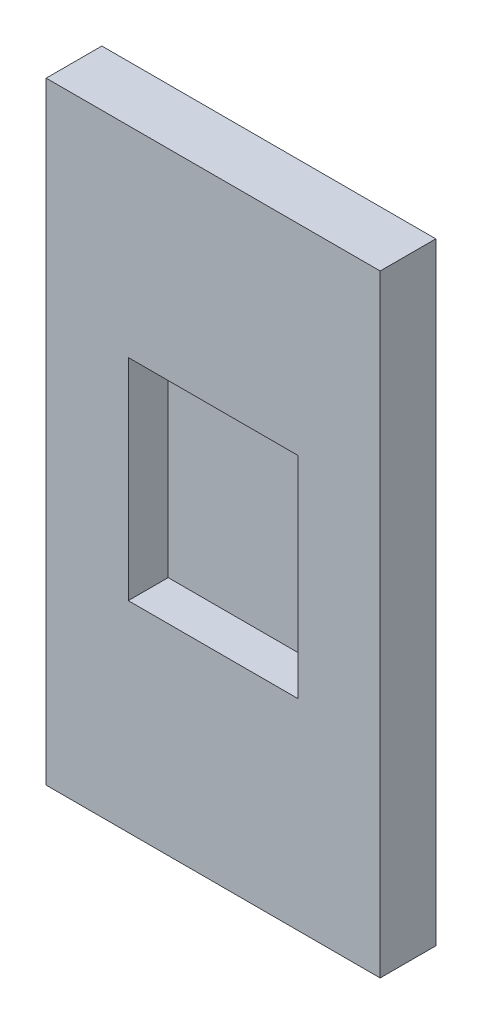
ISO-10303-21;
HEADER;
FILE_DESCRIPTION(('STEP AP214'),'2;1');
FILE_NAME('part.step','',(''),(''),'','','');
FILE_SCHEMA(('AUTOMOTIVE_DESIGN { 1 0 10303 214 1 1 1 1 }'));
ENDSEC;
DATA;
#1=APPLICATION_CONTEXT('core data for automotive mechanical design processes');
#2=APPLICATION_PROTOCOL_DEFINITION('international standard','automotive_design',2000,#1);
#3=PRODUCT_CONTEXT('',#1,'mechanical');
#4=PRODUCT('Part','Part','',(#3));
#5=PRODUCT_RELATED_PRODUCT_CATEGORY('part','',(#4));
#6=PRODUCT_DEFINITION_FORMATION('','',#4);
#7=PRODUCT_DEFINITION_CONTEXT('part definition',#1,'design');
#8=PRODUCT_DEFINITION('design','',#6,#7);
#9=PRODUCT_DEFINITION_SHAPE('','',#8);
#10=(LENGTH_UNIT() NAMED_UNIT(*) SI_UNIT(.MILLI.,.METRE.));
#11=(NAMED_UNIT(*) PLANE_ANGLE_UNIT() SI_UNIT($,.RADIAN.));
#12=(NAMED_UNIT(*) SI_UNIT($,.STERADIAN.) SOLID_ANGLE_UNIT());
#13=UNCERTAINTY_MEASURE_WITH_UNIT(LENGTH_MEASURE(1.E-05),#10,'distance_accuracy_value','');
#14=(GEOMETRIC_REPRESENTATION_CONTEXT(3) GLOBAL_UNCERTAINTY_ASSIGNED_CONTEXT((#13)) GLOBAL_UNIT_ASSIGNED_CONTEXT((#10,
#11,#12)) REPRESENTATION_CONTEXT('',''));
#15=CARTESIAN_POINT('',(0.,0.,0.));
#16=DIRECTION('',(0.,0.,1.));
#17=DIRECTION('',(1.,0.,0.));
#18=AXIS2_PLACEMENT_3D('',#15,#16,#17);
#19=CARTESIAN_POINT('',(9.,-16.5,3.));
#20=DIRECTION('',(-1.,0.,0.));
#21=DIRECTION('',(0.,0.,1.));
#22=AXIS2_PLACEMENT_3D('',#19,#20,#21);
#23=PLANE('',#22);
#24=DIRECTION('',(0.,1.,0.));
#25=VECTOR('',#24,1.);
#26=CARTESIAN_POINT('',(9.,-16.5,0.));
#27=LINE('',#26,#25);
#28=CARTESIAN_POINT('',(9.,-16.5,0.));
#29=VERTEX_POINT('',#28);
#30=CARTESIAN_POINT('',(9.,16.5,0.));
#31=VERTEX_POINT('',#30);
#32=EDGE_CURVE('E158',#29,#31,#27,.T.);
#33=ORIENTED_EDGE('',*,*,#32,.T.);
#34=DIRECTION('',(0.,0.,-1.));
#35=VECTOR('',#34,1.);
#36=CARTESIAN_POINT('',(9.,16.5,3.));
#37=LINE('',#36,#35);
#38=CARTESIAN_POINT('',(9.,16.5,3.));
#39=VERTEX_POINT('',#38);
#40=EDGE_CURVE('E11',#39,#31,#37,.T.);
#41=ORIENTED_EDGE('',*,*,#40,.F.);
#42=DIRECTION('',(0.,1.,0.));
#43=VECTOR('',#42,1.);
#44=CARTESIAN_POINT('',(9.,-16.5,3.));
#45=LINE('',#44,#43);
#46=CARTESIAN_POINT('',(9.,-16.5,3.));
#47=VERTEX_POINT('',#46);
#48=EDGE_CURVE('E164',#47,#39,#45,.T.);
#49=ORIENTED_EDGE('',*,*,#48,.F.);
#50=DIRECTION('',(0.,0.,-1.));
#51=VECTOR('',#50,1.);
#52=CARTESIAN_POINT('',(9.,-16.5,3.));
#53=LINE('',#52,#51);
#54=EDGE_CURVE('E174',#47,#29,#53,.T.);
#55=ORIENTED_EDGE('',*,*,#54,.T.);
#56=EDGE_LOOP('',(#33,#41,#49,#55));
#57=FACE_BOUND('',#56,.T.);
#58=ADVANCED_FACE('F39',(#57),#23,.F.);
#59=CARTESIAN_POINT('',(-9.,16.5,3.));
#60=DIRECTION('',(0.,-1.,0.));
#61=DIRECTION('',(0.,0.,-1.));
#62=AXIS2_PLACEMENT_3D('',#59,#60,#61);
#63=PLANE('',#62);
#64=DIRECTION('',(-1.,0.,0.));
#65=VECTOR('',#64,1.);
#66=CARTESIAN_POINT('',(-9.,16.5,0.));
#67=LINE('',#66,#65);
#68=CARTESIAN_POINT('',(-9.,16.5,0.));
#69=VERTEX_POINT('',#68);
#70=EDGE_CURVE('E178',#31,#69,#67,.T.);
#71=ORIENTED_EDGE('',*,*,#70,.T.);
#72=DIRECTION('',(0.,0.,-1.));
#73=VECTOR('',#72,1.);
#74=CARTESIAN_POINT('',(-9.,16.5,3.));
#75=LINE('',#74,#73);
#76=CARTESIAN_POINT('',(-9.,16.5,3.));
#77=VERTEX_POINT('',#76);
#78=EDGE_CURVE('E47',#77,#69,#75,.T.);
#79=ORIENTED_EDGE('',*,*,#78,.F.);
#80=DIRECTION('',(-1.,0.,0.));
#81=VECTOR('',#80,1.);
#82=CARTESIAN_POINT('',(-9.,16.5,3.));
#83=LINE('',#82,#81);
#84=EDGE_CURVE('E91',#39,#77,#83,.T.);
#85=ORIENTED_EDGE('',*,*,#84,.F.);
#86=ORIENTED_EDGE('',*,*,#40,.T.);
#87=EDGE_LOOP('',(#71,#79,#85,#86));
#88=FACE_BOUND('',#87,.T.);
#89=ADVANCED_FACE('F213',(#88),#63,.F.);
#90=CARTESIAN_POINT('',(-9.,-16.5,3.));
#91=DIRECTION('',(1.,0.,0.));
#92=DIRECTION('',(0.,0.,-1.));
#93=AXIS2_PLACEMENT_3D('',#90,#91,#92);
#94=PLANE('',#93);
#95=DIRECTION('',(0.,-1.,0.));
#96=VECTOR('',#95,1.);
#97=CARTESIAN_POINT('',(-9.,-16.5,0.));
#98=LINE('',#97,#96);
#99=CARTESIAN_POINT('',(-9.,-16.5,0.));
#100=VERTEX_POINT('',#99);
#101=EDGE_CURVE('E181',#69,#100,#98,.T.);
#102=ORIENTED_EDGE('',*,*,#101,.T.);
#103=DIRECTION('',(0.,0.,-1.));
#104=VECTOR('',#103,1.);
#105=CARTESIAN_POINT('',(-9.,-16.5,3.));
#106=LINE('',#105,#104);
#107=CARTESIAN_POINT('',(-9.,-16.5,3.));
#108=VERTEX_POINT('',#107);
#109=EDGE_CURVE('E188',#108,#100,#106,.T.);
#110=ORIENTED_EDGE('',*,*,#109,.F.);
#111=DIRECTION('',(0.,-1.,0.));
#112=VECTOR('',#111,1.);
#113=CARTESIAN_POINT('',(-9.,-16.5,3.));
#114=LINE('',#113,#112);
#115=EDGE_CURVE('E169',#77,#108,#114,.T.);
#116=ORIENTED_EDGE('',*,*,#115,.F.);
#117=ORIENTED_EDGE('',*,*,#78,.T.);
#118=EDGE_LOOP('',(#102,#110,#116,#117));
#119=FACE_BOUND('',#118,.T.);
#120=ADVANCED_FACE('F195',(#119),#94,.F.);
#121=CARTESIAN_POINT('',(-9.,-16.5,3.));
#122=DIRECTION('',(0.,1.,0.));
#123=DIRECTION('',(0.,0.,1.));
#124=AXIS2_PLACEMENT_3D('',#121,#122,#123);
#125=PLANE('',#124);
#126=DIRECTION('',(1.,0.,0.));
#127=VECTOR('',#126,1.);
#128=CARTESIAN_POINT('',(-9.,-16.5,0.));
#129=LINE('',#128,#127);
#130=EDGE_CURVE('E84',#100,#29,#129,.T.);
#131=ORIENTED_EDGE('',*,*,#130,.T.);
#132=ORIENTED_EDGE('',*,*,#54,.F.);
#133=DIRECTION('',(1.,0.,0.));
#134=VECTOR('',#133,1.);
#135=CARTESIAN_POINT('',(-9.,-16.5,3.));
#136=LINE('',#135,#134);
#137=EDGE_CURVE('E63',#108,#47,#136,.T.);
#138=ORIENTED_EDGE('',*,*,#137,.F.);
#139=ORIENTED_EDGE('',*,*,#109,.T.);
#140=EDGE_LOOP('',(#131,#132,#138,#139));
#141=FACE_BOUND('',#140,.T.);
#142=ADVANCED_FACE('F203',(#141),#125,.F.);
#143=CARTESIAN_POINT('',(0.,0.,3.));
#144=DIRECTION('',(0.,0.,-1.));
#145=DIRECTION('',(-1.,0.,0.));
#146=AXIS2_PLACEMENT_3D('',#143,#144,#145);
#147=PLANE('',#146);
#148=DIRECTION('',(-1.,0.,0.));
#149=VECTOR('',#148,1.);
#150=CARTESIAN_POINT('',(-4.575,5.675,3.));
#151=LINE('',#150,#149);
#152=CARTESIAN_POINT('',(4.575,5.675,3.));
#153=VERTEX_POINT('',#152);
#154=CARTESIAN_POINT('',(-4.575,5.675,3.));
#155=VERTEX_POINT('',#154);
#156=EDGE_CURVE('E149',#153,#155,#151,.T.);
#157=ORIENTED_EDGE('',*,*,#156,.F.);
#158=DIRECTION('',(0.,1.,0.));
#159=VECTOR('',#158,1.);
#160=CARTESIAN_POINT('',(4.575,-5.675,3.));
#161=LINE('',#160,#159);
#162=CARTESIAN_POINT('',(4.575,-5.675,3.));
#163=VERTEX_POINT('',#162);
#164=EDGE_CURVE('E54',#163,#153,#161,.T.);
#165=ORIENTED_EDGE('',*,*,#164,.F.);
#166=DIRECTION('',(1.,0.,0.));
#167=VECTOR('',#166,1.);
#168=CARTESIAN_POINT('',(-4.575,-5.675,3.));
#169=LINE('',#168,#167);
#170=CARTESIAN_POINT('',(-4.575,-5.675,3.));
#171=VERTEX_POINT('',#170);
#172=EDGE_CURVE('E136',#171,#163,#169,.T.);
#173=ORIENTED_EDGE('',*,*,#172,.F.);
#174=DIRECTION('',(0.,-1.,0.));
#175=VECTOR('',#174,1.);
#176=CARTESIAN_POINT('',(-4.575,-5.675,3.));
#177=LINE('',#176,#175);
#178=EDGE_CURVE('E140',#155,#171,#177,.T.);
#179=ORIENTED_EDGE('',*,*,#178,.F.);
#180=EDGE_LOOP('',(#157,#165,#173,#179));
#181=FACE_BOUND('',#180,.T.);
#182=ORIENTED_EDGE('',*,*,#48,.T.);
#183=ORIENTED_EDGE('',*,*,#84,.T.);
#184=ORIENTED_EDGE('',*,*,#115,.T.);
#185=ORIENTED_EDGE('',*,*,#137,.T.);
#186=EDGE_LOOP('',(#182,#183,#184,#185));
#187=FACE_BOUND('',#186,.T.);
#188=ADVANCED_FACE('F205',(#181,#187),#147,.F.);
#189=CARTESIAN_POINT('',(0.,0.,0.));
#190=DIRECTION('',(0.,0.,-1.));
#191=DIRECTION('',(-1.,0.,0.));
#192=AXIS2_PLACEMENT_3D('',#189,#190,#191);
#193=PLANE('',#192);
#194=ORIENTED_EDGE('',*,*,#32,.F.);
#195=ORIENTED_EDGE('',*,*,#130,.F.);
#196=ORIENTED_EDGE('',*,*,#101,.F.);
#197=ORIENTED_EDGE('',*,*,#70,.F.);
#198=EDGE_LOOP('',(#194,#195,#196,#197));
#199=FACE_BOUND('',#198,.T.);
#200=ADVANCED_FACE('F199',(#199),#193,.T.);
#201=CARTESIAN_POINT('',(4.575,-5.675,0.85));
#202=DIRECTION('',(1.,0.,0.));
#203=DIRECTION('',(0.,0.,-1.));
#204=AXIS2_PLACEMENT_3D('',#201,#202,#203);
#205=PLANE('',#204);
#206=ORIENTED_EDGE('',*,*,#164,.T.);
#207=DIRECTION('',(0.,0.,1.));
#208=VECTOR('',#207,1.);
#209=CARTESIAN_POINT('',(4.575,5.675,0.85));
#210=LINE('',#209,#208);
#211=CARTESIAN_POINT('',(4.575,5.675,0.85));
#212=VERTEX_POINT('',#211);
#213=EDGE_CURVE('E111',#212,#153,#210,.T.);
#214=ORIENTED_EDGE('',*,*,#213,.F.);
#215=DIRECTION('',(0.,1.,0.));
#216=VECTOR('',#215,1.);
#217=CARTESIAN_POINT('',(4.575,-5.675,0.85));
#218=LINE('',#217,#216);
#219=CARTESIAN_POINT('',(4.575,-5.675,0.85));
#220=VERTEX_POINT('',#219);
#221=EDGE_CURVE('E115',#220,#212,#218,.T.);
#222=ORIENTED_EDGE('',*,*,#221,.F.);
#223=DIRECTION('',(0.,0.,1.));
#224=VECTOR('',#223,1.);
#225=CARTESIAN_POINT('',(4.575,-5.675,0.85));
#226=LINE('',#225,#224);
#227=EDGE_CURVE('E155',#220,#163,#226,.T.);
#228=ORIENTED_EDGE('',*,*,#227,.T.);
#229=EDGE_LOOP('',(#206,#214,#222,#228));
#230=FACE_BOUND('',#229,.T.);
#231=ADVANCED_FACE('F113',(#230),#205,.F.);
#232=CARTESIAN_POINT('',(-4.575,-5.675,0.85));
#233=DIRECTION('',(0.,-1.,0.));
#234=DIRECTION('',(0.,0.,-1.));
#235=AXIS2_PLACEMENT_3D('',#232,#233,#234);
#236=PLANE('',#235);
#237=ORIENTED_EDGE('',*,*,#172,.T.);
#238=ORIENTED_EDGE('',*,*,#227,.F.);
#239=DIRECTION('',(1.,0.,0.));
#240=VECTOR('',#239,1.);
#241=CARTESIAN_POINT('',(-4.575,-5.675,0.85));
#242=LINE('',#241,#240);
#243=CARTESIAN_POINT('',(-4.575,-5.675,0.85));
#244=VERTEX_POINT('',#243);
#245=EDGE_CURVE('E122',#244,#220,#242,.T.);
#246=ORIENTED_EDGE('',*,*,#245,.F.);
#247=DIRECTION('',(0.,0.,1.));
#248=VECTOR('',#247,1.);
#249=CARTESIAN_POINT('',(-4.575,-5.675,0.85));
#250=LINE('',#249,#248);
#251=EDGE_CURVE('E159',#244,#171,#250,.T.);
#252=ORIENTED_EDGE('',*,*,#251,.T.);
#253=EDGE_LOOP('',(#237,#238,#246,#252));
#254=FACE_BOUND('',#253,.T.);
#255=ADVANCED_FACE('F252',(#254),#236,.F.);
#256=CARTESIAN_POINT('',(-4.575,-5.675,0.85));
#257=DIRECTION('',(-1.,0.,0.));
#258=DIRECTION('',(0.,0.,1.));
#259=AXIS2_PLACEMENT_3D('',#256,#257,#258);
#260=PLANE('',#259);
#261=ORIENTED_EDGE('',*,*,#178,.T.);
#262=ORIENTED_EDGE('',*,*,#251,.F.);
#263=DIRECTION('',(0.,-1.,0.));
#264=VECTOR('',#263,1.);
#265=CARTESIAN_POINT('',(-4.575,-5.675,0.85));
#266=LINE('',#265,#264);
#267=CARTESIAN_POINT('',(-4.575,5.675,0.85));
#268=VERTEX_POINT('',#267);
#269=EDGE_CURVE('E131',#268,#244,#266,.T.);
#270=ORIENTED_EDGE('',*,*,#269,.F.);
#271=DIRECTION('',(0.,0.,1.));
#272=VECTOR('',#271,1.);
#273=CARTESIAN_POINT('',(-4.575,5.675,0.85));
#274=LINE('',#273,#272);
#275=EDGE_CURVE('E121',#268,#155,#274,.T.);
#276=ORIENTED_EDGE('',*,*,#275,.T.);
#277=EDGE_LOOP('',(#261,#262,#270,#276));
#278=FACE_BOUND('',#277,.T.);
#279=ADVANCED_FACE('F261',(#278),#260,.F.);
#280=CARTESIAN_POINT('',(-4.575,5.675,0.85));
#281=DIRECTION('',(0.,1.,0.));
#282=DIRECTION('',(0.,0.,1.));
#283=AXIS2_PLACEMENT_3D('',#280,#281,#282);
#284=PLANE('',#283);
#285=ORIENTED_EDGE('',*,*,#156,.T.);
#286=ORIENTED_EDGE('',*,*,#275,.F.);
#287=DIRECTION('',(-1.,0.,0.));
#288=VECTOR('',#287,1.);
#289=CARTESIAN_POINT('',(-4.575,5.675,0.85));
#290=LINE('',#289,#288);
#291=EDGE_CURVE('E125',#212,#268,#290,.T.);
#292=ORIENTED_EDGE('',*,*,#291,.F.);
#293=ORIENTED_EDGE('',*,*,#213,.T.);
#294=EDGE_LOOP('',(#285,#286,#292,#293));
#295=FACE_BOUND('',#294,.T.);
#296=ADVANCED_FACE('F126',(#295),#284,.F.);
#297=CARTESIAN_POINT('',(0.,0.,0.85));
#298=DIRECTION('',(0.,0.,-1.));
#299=DIRECTION('',(-1.,0.,0.));
#300=AXIS2_PLACEMENT_3D('',#297,#298,#299);
#301=PLANE('',#300);
#302=ORIENTED_EDGE('',*,*,#221,.T.);
#303=ORIENTED_EDGE('',*,*,#291,.T.);
#304=ORIENTED_EDGE('',*,*,#269,.T.);
#305=ORIENTED_EDGE('',*,*,#245,.T.);
#306=EDGE_LOOP('',(#302,#303,#304,#305));
#307=FACE_BOUND('',#306,.T.);
#308=ADVANCED_FACE('F133',(#307),#301,.F.);
#309=CLOSED_SHELL('',(#58,#89,#120,#142,#188,#200,#231,#255,#279,#296,#308));
#310=MANIFOLD_SOLID_BREP('B2',#309);
#311=ADVANCED_BREP_SHAPE_REPRESENTATION('',(#18,#310),#14);
#312=SHAPE_DEFINITION_REPRESENTATION(#9,#311);
ENDSEC;
END-ISO-10303-21;
